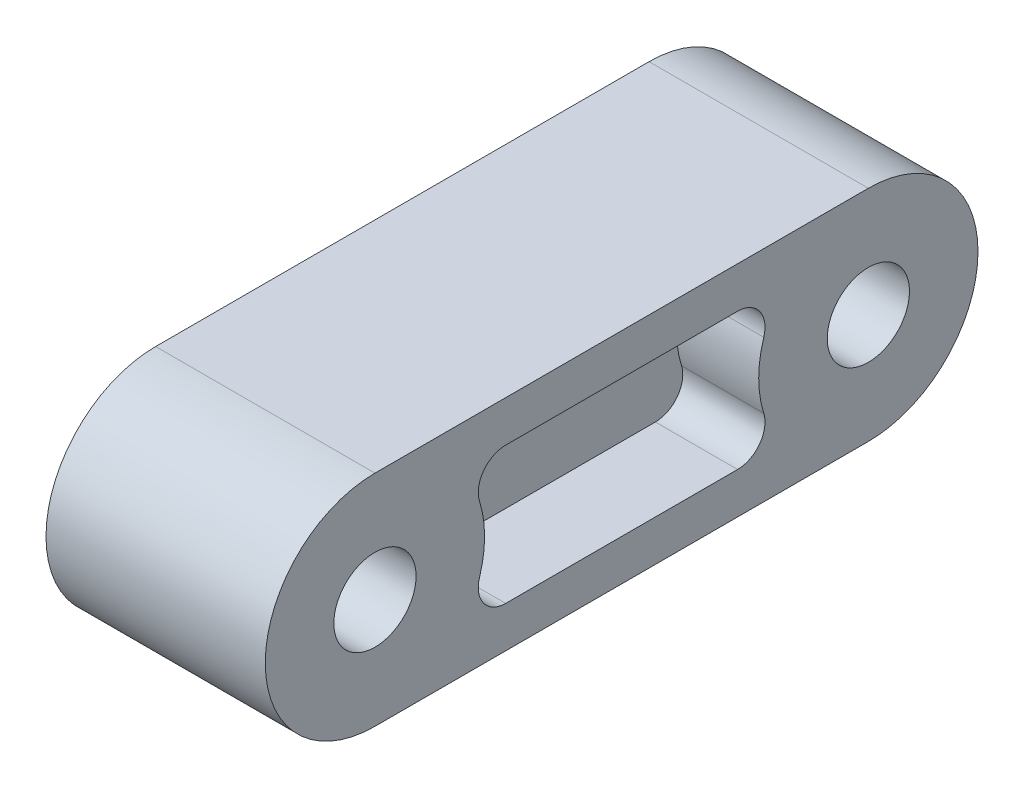
ISO-10303-21;
HEADER;
FILE_DESCRIPTION(('STEP AP214'),'2;1');
FILE_NAME('part.step','',(''),(''),'','','');
FILE_SCHEMA(('AUTOMOTIVE_DESIGN { 1 0 10303 214 1 1 1 1 }'));
ENDSEC;
DATA;
#1=APPLICATION_CONTEXT('core data for automotive mechanical design processes');
#2=APPLICATION_PROTOCOL_DEFINITION('international standard','automotive_design',2000,#1);
#3=PRODUCT_CONTEXT('',#1,'mechanical');
#4=PRODUCT('Part','Part','',(#3));
#5=PRODUCT_RELATED_PRODUCT_CATEGORY('part','',(#4));
#6=PRODUCT_DEFINITION_FORMATION('','',#4);
#7=PRODUCT_DEFINITION_CONTEXT('part definition',#1,'design');
#8=PRODUCT_DEFINITION('design','',#6,#7);
#9=PRODUCT_DEFINITION_SHAPE('','',#8);
#10=(LENGTH_UNIT() NAMED_UNIT(*) SI_UNIT(.MILLI.,.METRE.));
#11=(NAMED_UNIT(*) PLANE_ANGLE_UNIT() SI_UNIT($,.RADIAN.));
#12=(NAMED_UNIT(*) SI_UNIT($,.STERADIAN.) SOLID_ANGLE_UNIT());
#13=UNCERTAINTY_MEASURE_WITH_UNIT(LENGTH_MEASURE(1.E-05),#10,'distance_accuracy_value','');
#14=(GEOMETRIC_REPRESENTATION_CONTEXT(3) GLOBAL_UNCERTAINTY_ASSIGNED_CONTEXT((#13)) GLOBAL_UNIT_ASSIGNED_CONTEXT((#10,
#11,#12)) REPRESENTATION_CONTEXT('',''));
#15=CARTESIAN_POINT('',(0.,0.,0.));
#16=DIRECTION('',(0.,0.,1.));
#17=DIRECTION('',(1.,0.,0.));
#18=AXIS2_PLACEMENT_3D('',#15,#16,#17);
#19=CARTESIAN_POINT('',(-4.,0.,0.));
#20=DIRECTION('',(1.,0.,0.));
#21=DIRECTION('',(0.,0.,-1.));
#22=AXIS2_PLACEMENT_3D('',#19,#20,#21);
#23=PLANE('',#22);
#24=CARTESIAN_POINT('',(-4.,0.,-18.));
#25=DIRECTION('',(1.,0.,0.));
#26=DIRECTION('',(0.,0.,-1.));
#27=AXIS2_PLACEMENT_3D('',#24,#25,#26);
#28=CIRCLE('',#27,1.5);
#29=CARTESIAN_POINT('',(-4.,0.,-19.5));
#30=VERTEX_POINT('',#29);
#31=EDGE_CURVE('E314',#30,#30,#28,.T.);
#32=ORIENTED_EDGE('',*,*,#31,.T.);
#33=EDGE_LOOP('',(#32));
#34=FACE_BOUND('',#33,.T.);
#35=CARTESIAN_POINT('',(-4.,0.,0.));
#36=DIRECTION('',(1.,0.,0.));
#37=DIRECTION('',(0.,0.,-1.));
#38=AXIS2_PLACEMENT_3D('',#35,#36,#37);
#39=CIRCLE('',#38,1.5);
#40=CARTESIAN_POINT('',(-4.,0.,-1.5));
#41=VERTEX_POINT('',#40);
#42=EDGE_CURVE('E324',#41,#41,#39,.T.);
#43=ORIENTED_EDGE('',*,*,#42,.T.);
#44=EDGE_LOOP('',(#43));
#45=FACE_BOUND('',#44,.T.);
#46=CARTESIAN_POINT('',(-4.,0.,0.));
#47=DIRECTION('',(1.,0.,0.));
#48=DIRECTION('',(0.,0.,-1.));
#49=AXIS2_PLACEMENT_3D('',#46,#47,#48);
#50=CIRCLE('',#49,4.);
#51=CARTESIAN_POINT('',(-4.,4.,0.));
#52=VERTEX_POINT('',#51);
#53=CARTESIAN_POINT('',(-4.,-4.,0.));
#54=VERTEX_POINT('',#53);
#55=EDGE_CURVE('E203',#52,#54,#50,.T.);
#56=ORIENTED_EDGE('',*,*,#55,.F.);
#57=DIRECTION('',(0.,0.,1.));
#58=VECTOR('',#57,1.);
#59=CARTESIAN_POINT('',(-4.,4.,0.));
#60=LINE('',#59,#58);
#61=CARTESIAN_POINT('',(-4.,4.,-18.));
#62=VERTEX_POINT('',#61);
#63=EDGE_CURVE('E199',#62,#52,#60,.T.);
#64=ORIENTED_EDGE('',*,*,#63,.F.);
#65=CARTESIAN_POINT('',(-4.,0.,-18.));
#66=DIRECTION('',(1.,0.,0.));
#67=DIRECTION('',(0.,0.,-1.));
#68=AXIS2_PLACEMENT_3D('',#65,#66,#67);
#69=CIRCLE('',#68,4.);
#70=CARTESIAN_POINT('',(-4.,-4.,-18.));
#71=VERTEX_POINT('',#70);
#72=EDGE_CURVE('E338',#71,#62,#69,.T.);
#73=ORIENTED_EDGE('',*,*,#72,.F.);
#74=DIRECTION('',(0.,0.,-1.));
#75=VECTOR('',#74,1.);
#76=CARTESIAN_POINT('',(-4.,-4.,0.));
#77=LINE('',#76,#75);
#78=EDGE_CURVE('E336',#54,#71,#77,.T.);
#79=ORIENTED_EDGE('',*,*,#78,.F.);
#80=EDGE_LOOP('',(#56,#64,#73,#79));
#81=FACE_BOUND('',#80,.T.);
#82=DIRECTION('',(0.,0.,-1.));
#83=VECTOR('',#82,1.);
#84=CARTESIAN_POINT('',(-4.,-2.5,-3.1224989991992));
#85=LINE('',#84,#83);
#86=CARTESIAN_POINT('',(-4.,-2.5,-4.76969600708473));
#87=VERTEX_POINT('',#86);
#88=CARTESIAN_POINT('',(-4.,-2.5,-13.2303039929153));
#89=VERTEX_POINT('',#88);
#90=EDGE_CURVE('E437',#87,#89,#85,.T.);
#91=ORIENTED_EDGE('',*,*,#90,.T.);
#92=CARTESIAN_POINT('',(-4.,-1.5,-13.2303039929153));
#93=DIRECTION('',(1.,0.,0.));
#94=DIRECTION('',(0.,0.,-1.));
#95=AXIS2_PLACEMENT_3D('',#92,#93,#94);
#96=CIRCLE('',#95,1.);
#97=CARTESIAN_POINT('',(-4.,-1.2,-14.1842431943322));
#98=VERTEX_POINT('',#97);
#99=EDGE_CURVE('E270',#89,#98,#96,.T.);
#100=ORIENTED_EDGE('',*,*,#99,.T.);
#101=CARTESIAN_POINT('',(-4.,0.,-18.));
#102=DIRECTION('',(-1.,0.,0.));
#103=DIRECTION('',(0.,0.,-1.));
#104=AXIS2_PLACEMENT_3D('',#101,#102,#103);
#105=CIRCLE('',#104,4.);
#106=CARTESIAN_POINT('',(-4.,1.2,-14.1842431943322));
#107=VERTEX_POINT('',#106);
#108=EDGE_CURVE('E438',#98,#107,#105,.T.);
#109=ORIENTED_EDGE('',*,*,#108,.T.);
#110=CARTESIAN_POINT('',(-4.,1.5,-13.2303039929153));
#111=DIRECTION('',(1.,0.,0.));
#112=DIRECTION('',(0.,0.,-1.));
#113=AXIS2_PLACEMENT_3D('',#110,#111,#112);
#114=CIRCLE('',#113,1.);
#115=CARTESIAN_POINT('',(-4.,2.5,-13.2303039929153));
#116=VERTEX_POINT('',#115);
#117=EDGE_CURVE('E268',#107,#116,#114,.T.);
#118=ORIENTED_EDGE('',*,*,#117,.T.);
#119=DIRECTION('',(0.,0.,1.));
#120=VECTOR('',#119,1.);
#121=CARTESIAN_POINT('',(-4.,2.5,-14.8775010008008));
#122=LINE('',#121,#120);
#123=CARTESIAN_POINT('',(-4.,2.5,-4.76969600708473));
#124=VERTEX_POINT('',#123);
#125=EDGE_CURVE('E308',#116,#124,#122,.T.);
#126=ORIENTED_EDGE('',*,*,#125,.T.);
#127=CARTESIAN_POINT('',(-4.,1.5,-4.76969600708473));
#128=DIRECTION('',(1.,0.,0.));
#129=DIRECTION('',(0.,0.,-1.));
#130=AXIS2_PLACEMENT_3D('',#127,#128,#129);
#131=CIRCLE('',#130,1.);
#132=CARTESIAN_POINT('',(-4.,1.2,-3.81575680566778));
#133=VERTEX_POINT('',#132);
#134=EDGE_CURVE('E266',#124,#133,#131,.T.);
#135=ORIENTED_EDGE('',*,*,#134,.T.);
#136=CARTESIAN_POINT('',(-4.,0.,0.));
#137=DIRECTION('',(-1.,0.,0.));
#138=DIRECTION('',(0.,0.,-1.));
#139=AXIS2_PLACEMENT_3D('',#136,#137,#138);
#140=CIRCLE('',#139,4.);
#141=CARTESIAN_POINT('',(-4.,-1.2,-3.81575680566778));
#142=VERTEX_POINT('',#141);
#143=EDGE_CURVE('E432',#133,#142,#140,.T.);
#144=ORIENTED_EDGE('',*,*,#143,.T.);
#145=CARTESIAN_POINT('',(-4.,-1.5,-4.76969600708473));
#146=DIRECTION('',(1.,0.,0.));
#147=DIRECTION('',(0.,0.,-1.));
#148=AXIS2_PLACEMENT_3D('',#145,#146,#147);
#149=CIRCLE('',#148,1.);
#150=EDGE_CURVE('E264',#142,#87,#149,.T.);
#151=ORIENTED_EDGE('',*,*,#150,.T.);
#152=EDGE_LOOP('',(#91,#100,#109,#118,#126,#135,#144,#151));
#153=FACE_BOUND('',#152,.T.);
#154=ADVANCED_FACE('F41',(#34,#45,#81,#153),#23,.F.);
#155=CARTESIAN_POINT('',(4.,0.,0.));
#156=DIRECTION('',(1.,0.,0.));
#157=DIRECTION('',(0.,0.,-1.));
#158=AXIS2_PLACEMENT_3D('',#155,#156,#157);
#159=PLANE('',#158);
#160=CARTESIAN_POINT('',(4.,0.,-18.));
#161=DIRECTION('',(-1.,0.,0.));
#162=DIRECTION('',(0.,0.,-1.));
#163=AXIS2_PLACEMENT_3D('',#160,#161,#162);
#164=CIRCLE('',#163,4.);
#165=CARTESIAN_POINT('',(4.,-1.2,-14.1842431943322));
#166=VERTEX_POINT('',#165);
#167=CARTESIAN_POINT('',(4.,1.2,-14.1842431943322));
#168=VERTEX_POINT('',#167);
#169=EDGE_CURVE('E279',#166,#168,#164,.T.);
#170=ORIENTED_EDGE('',*,*,#169,.F.);
#171=CARTESIAN_POINT('',(4.,-1.5,-13.2303039929153));
#172=DIRECTION('',(1.,0.,0.));
#173=DIRECTION('',(0.,0.,-1.));
#174=AXIS2_PLACEMENT_3D('',#171,#172,#173);
#175=CIRCLE('',#174,1.);
#176=CARTESIAN_POINT('',(4.,-2.5,-13.2303039929153));
#177=VERTEX_POINT('',#176);
#178=EDGE_CURVE('E49',#166,#177,#175,.F.);
#179=ORIENTED_EDGE('',*,*,#178,.T.);
#180=DIRECTION('',(0.,0.,-1.));
#181=VECTOR('',#180,1.);
#182=CARTESIAN_POINT('',(4.,-2.5,-3.1224989991992));
#183=LINE('',#182,#181);
#184=CARTESIAN_POINT('',(4.,-2.5,-4.76969600708473));
#185=VERTEX_POINT('',#184);
#186=EDGE_CURVE('E277',#185,#177,#183,.T.);
#187=ORIENTED_EDGE('',*,*,#186,.F.);
#188=CARTESIAN_POINT('',(4.,-1.5,-4.76969600708473));
#189=DIRECTION('',(1.,0.,0.));
#190=DIRECTION('',(0.,0.,-1.));
#191=AXIS2_PLACEMENT_3D('',#188,#189,#190);
#192=CIRCLE('',#191,1.);
#193=CARTESIAN_POINT('',(4.,-1.2,-3.81575680566778));
#194=VERTEX_POINT('',#193);
#195=EDGE_CURVE('E56',#185,#194,#192,.F.);
#196=ORIENTED_EDGE('',*,*,#195,.T.);
#197=CARTESIAN_POINT('',(4.,0.,0.));
#198=DIRECTION('',(-1.,0.,0.));
#199=DIRECTION('',(0.,0.,-1.));
#200=AXIS2_PLACEMENT_3D('',#197,#198,#199);
#201=CIRCLE('',#200,4.);
#202=CARTESIAN_POINT('',(4.,1.2,-3.81575680566778));
#203=VERTEX_POINT('',#202);
#204=EDGE_CURVE('E289',#203,#194,#201,.T.);
#205=ORIENTED_EDGE('',*,*,#204,.F.);
#206=CARTESIAN_POINT('',(4.,1.5,-4.76969600708473));
#207=DIRECTION('',(1.,0.,0.));
#208=DIRECTION('',(0.,0.,-1.));
#209=AXIS2_PLACEMENT_3D('',#206,#207,#208);
#210=CIRCLE('',#209,1.);
#211=CARTESIAN_POINT('',(4.,2.5,-4.76969600708473));
#212=VERTEX_POINT('',#211);
#213=EDGE_CURVE('E11',#203,#212,#210,.F.);
#214=ORIENTED_EDGE('',*,*,#213,.T.);
#215=DIRECTION('',(0.,0.,1.));
#216=VECTOR('',#215,1.);
#217=CARTESIAN_POINT('',(4.,2.5,-14.8775010008008));
#218=LINE('',#217,#216);
#219=CARTESIAN_POINT('',(4.,2.5,-13.2303039929153));
#220=VERTEX_POINT('',#219);
#221=EDGE_CURVE('E316',#220,#212,#218,.T.);
#222=ORIENTED_EDGE('',*,*,#221,.F.);
#223=CARTESIAN_POINT('',(4.,1.5,-13.2303039929153));
#224=DIRECTION('',(1.,0.,0.));
#225=DIRECTION('',(0.,0.,-1.));
#226=AXIS2_PLACEMENT_3D('',#223,#224,#225);
#227=CIRCLE('',#226,1.);
#228=EDGE_CURVE('E272',#220,#168,#227,.F.);
#229=ORIENTED_EDGE('',*,*,#228,.T.);
#230=EDGE_LOOP('',(#170,#179,#187,#196,#205,#214,#222,#229));
#231=FACE_BOUND('',#230,.T.);
#232=CARTESIAN_POINT('',(4.,0.,0.));
#233=DIRECTION('',(1.,0.,0.));
#234=DIRECTION('',(0.,0.,-1.));
#235=AXIS2_PLACEMENT_3D('',#232,#233,#234);
#236=CIRCLE('',#235,1.5);
#237=CARTESIAN_POINT('',(4.,0.,-1.5));
#238=VERTEX_POINT('',#237);
#239=EDGE_CURVE('E327',#238,#238,#236,.T.);
#240=ORIENTED_EDGE('',*,*,#239,.F.);
#241=EDGE_LOOP('',(#240));
#242=FACE_BOUND('',#241,.T.);
#243=CARTESIAN_POINT('',(4.,0.,0.));
#244=DIRECTION('',(1.,0.,0.));
#245=DIRECTION('',(0.,0.,-1.));
#246=AXIS2_PLACEMENT_3D('',#243,#244,#245);
#247=CIRCLE('',#246,4.);
#248=CARTESIAN_POINT('',(4.,4.,0.));
#249=VERTEX_POINT('',#248);
#250=CARTESIAN_POINT('',(4.,-4.,0.));
#251=VERTEX_POINT('',#250);
#252=EDGE_CURVE('E189',#249,#251,#247,.T.);
#253=ORIENTED_EDGE('',*,*,#252,.T.);
#254=DIRECTION('',(0.,0.,-1.));
#255=VECTOR('',#254,1.);
#256=CARTESIAN_POINT('',(4.,-4.,0.));
#257=LINE('',#256,#255);
#258=CARTESIAN_POINT('',(4.,-4.,-18.));
#259=VERTEX_POINT('',#258);
#260=EDGE_CURVE('E178',#251,#259,#257,.T.);
#261=ORIENTED_EDGE('',*,*,#260,.T.);
#262=CARTESIAN_POINT('',(4.,0.,-18.));
#263=DIRECTION('',(1.,0.,0.));
#264=DIRECTION('',(0.,0.,-1.));
#265=AXIS2_PLACEMENT_3D('',#262,#263,#264);
#266=CIRCLE('',#265,4.);
#267=CARTESIAN_POINT('',(4.,4.,-18.));
#268=VERTEX_POINT('',#267);
#269=EDGE_CURVE('E188',#259,#268,#266,.T.);
#270=ORIENTED_EDGE('',*,*,#269,.T.);
#271=DIRECTION('',(0.,0.,1.));
#272=VECTOR('',#271,1.);
#273=CARTESIAN_POINT('',(4.,4.,0.));
#274=LINE('',#273,#272);
#275=EDGE_CURVE('E195',#268,#249,#274,.T.);
#276=ORIENTED_EDGE('',*,*,#275,.T.);
#277=EDGE_LOOP('',(#253,#261,#270,#276));
#278=FACE_BOUND('',#277,.T.);
#279=CARTESIAN_POINT('',(4.,0.,-18.));
#280=DIRECTION('',(1.,0.,0.));
#281=DIRECTION('',(0.,0.,-1.));
#282=AXIS2_PLACEMENT_3D('',#279,#280,#281);
#283=CIRCLE('',#282,1.5);
#284=CARTESIAN_POINT('',(4.,0.,-19.5));
#285=VERTEX_POINT('',#284);
#286=EDGE_CURVE('E321',#285,#285,#283,.T.);
#287=ORIENTED_EDGE('',*,*,#286,.F.);
#288=EDGE_LOOP('',(#287));
#289=FACE_BOUND('',#288,.T.);
#290=ADVANCED_FACE('F192',(#231,#242,#278,#289),#159,.T.);
#291=CARTESIAN_POINT('',(4.,0.,0.));
#292=DIRECTION('',(-1.,0.,0.));
#293=DIRECTION('',(0.,0.,1.));
#294=AXIS2_PLACEMENT_3D('',#291,#292,#293);
#295=CYLINDRICAL_SURFACE('',#294,4.);
#296=ORIENTED_EDGE('',*,*,#55,.T.);
#297=DIRECTION('',(-1.,0.,0.));
#298=VECTOR('',#297,1.);
#299=CARTESIAN_POINT('',(4.,-4.,0.));
#300=LINE('',#299,#298);
#301=EDGE_CURVE('E182',#251,#54,#300,.T.);
#302=ORIENTED_EDGE('',*,*,#301,.F.);
#303=ORIENTED_EDGE('',*,*,#252,.F.);
#304=DIRECTION('',(-1.,0.,0.));
#305=VECTOR('',#304,1.);
#306=CARTESIAN_POINT('',(4.,4.,0.));
#307=LINE('',#306,#305);
#308=EDGE_CURVE('E334',#249,#52,#307,.T.);
#309=ORIENTED_EDGE('',*,*,#308,.T.);
#310=EDGE_LOOP('',(#296,#302,#303,#309));
#311=FACE_BOUND('',#310,.T.);
#312=ADVANCED_FACE('F201',(#311),#295,.T.);
#313=CARTESIAN_POINT('',(4.,-4.,0.));
#314=DIRECTION('',(0.,1.,0.));
#315=DIRECTION('',(0.,0.,1.));
#316=AXIS2_PLACEMENT_3D('',#313,#314,#315);
#317=PLANE('',#316);
#318=ORIENTED_EDGE('',*,*,#78,.T.);
#319=DIRECTION('',(-1.,0.,0.));
#320=VECTOR('',#319,1.);
#321=CARTESIAN_POINT('',(4.,-4.,-18.));
#322=LINE('',#321,#320);
#323=EDGE_CURVE('E185',#259,#71,#322,.T.);
#324=ORIENTED_EDGE('',*,*,#323,.F.);
#325=ORIENTED_EDGE('',*,*,#260,.F.);
#326=ORIENTED_EDGE('',*,*,#301,.T.);
#327=EDGE_LOOP('',(#318,#324,#325,#326));
#328=FACE_BOUND('',#327,.T.);
#329=ADVANCED_FACE('F180',(#328),#317,.F.);
#330=CARTESIAN_POINT('',(4.,0.,-18.));
#331=DIRECTION('',(-1.,0.,0.));
#332=DIRECTION('',(0.,0.,1.));
#333=AXIS2_PLACEMENT_3D('',#330,#331,#332);
#334=CYLINDRICAL_SURFACE('',#333,4.);
#335=ORIENTED_EDGE('',*,*,#72,.T.);
#336=DIRECTION('',(-1.,0.,0.));
#337=VECTOR('',#336,1.);
#338=CARTESIAN_POINT('',(4.,4.,-18.));
#339=LINE('',#338,#337);
#340=EDGE_CURVE('E208',#268,#62,#339,.T.);
#341=ORIENTED_EDGE('',*,*,#340,.F.);
#342=ORIENTED_EDGE('',*,*,#269,.F.);
#343=ORIENTED_EDGE('',*,*,#323,.T.);
#344=EDGE_LOOP('',(#335,#341,#342,#343));
#345=FACE_BOUND('',#344,.T.);
#346=ADVANCED_FACE('F350',(#345),#334,.T.);
#347=CARTESIAN_POINT('',(4.,4.,0.));
#348=DIRECTION('',(0.,-1.,0.));
#349=DIRECTION('',(0.,0.,-1.));
#350=AXIS2_PLACEMENT_3D('',#347,#348,#349);
#351=PLANE('',#350);
#352=ORIENTED_EDGE('',*,*,#63,.T.);
#353=ORIENTED_EDGE('',*,*,#308,.F.);
#354=ORIENTED_EDGE('',*,*,#275,.F.);
#355=ORIENTED_EDGE('',*,*,#340,.T.);
#356=EDGE_LOOP('',(#352,#353,#354,#355));
#357=FACE_BOUND('',#356,.T.);
#358=ADVANCED_FACE('F345',(#357),#351,.F.);
#359=CARTESIAN_POINT('',(4.,0.,0.));
#360=DIRECTION('',(-1.,0.,0.));
#361=DIRECTION('',(0.,0.,1.));
#362=AXIS2_PLACEMENT_3D('',#359,#360,#361);
#363=CYLINDRICAL_SURFACE('',#362,1.5);
#364=ORIENTED_EDGE('',*,*,#239,.T.);
#365=EDGE_LOOP('',(#364));
#366=FACE_BOUND('',#365,.T.);
#367=ORIENTED_EDGE('',*,*,#42,.F.);
#368=EDGE_LOOP('',(#367));
#369=FACE_BOUND('',#368,.T.);
#370=ADVANCED_FACE('F357',(#366,#369),#363,.F.);
#371=CARTESIAN_POINT('',(4.,0.,-18.));
#372=DIRECTION('',(-1.,0.,0.));
#373=DIRECTION('',(0.,0.,1.));
#374=AXIS2_PLACEMENT_3D('',#371,#372,#373);
#375=CYLINDRICAL_SURFACE('',#374,1.5);
#376=ORIENTED_EDGE('',*,*,#286,.T.);
#377=EDGE_LOOP('',(#376));
#378=FACE_BOUND('',#377,.T.);
#379=ORIENTED_EDGE('',*,*,#31,.F.);
#380=EDGE_LOOP('',(#379));
#381=FACE_BOUND('',#380,.T.);
#382=ADVANCED_FACE('F372',(#378,#381),#375,.F.);
#383=CARTESIAN_POINT('',(1.,0.,-18.));
#384=DIRECTION('',(1.,0.,0.));
#385=DIRECTION('',(0.,0.,-1.));
#386=AXIS2_PLACEMENT_3D('',#383,#384,#385);
#387=CYLINDRICAL_SURFACE('',#386,4.);
#388=ORIENTED_EDGE('',*,*,#169,.T.);
#389=DIRECTION('',(1.,0.,0.));
#390=VECTOR('',#389,1.);
#391=CARTESIAN_POINT('',(1.,1.2,-14.1842431943322));
#392=LINE('',#391,#390);
#393=CARTESIAN_POINT('',(1.,1.2,-14.1842431943322));
#394=VERTEX_POINT('',#393);
#395=EDGE_CURVE('E245',#168,#394,#392,.F.);
#396=ORIENTED_EDGE('',*,*,#395,.T.);
#397=CARTESIAN_POINT('',(1.,0.,-18.));
#398=DIRECTION('',(-1.,0.,0.));
#399=DIRECTION('',(0.,0.,-1.));
#400=AXIS2_PLACEMENT_3D('',#397,#398,#399);
#401=CIRCLE('',#400,4.);
#402=CARTESIAN_POINT('',(1.,-1.2,-14.1842431943322));
#403=VERTEX_POINT('',#402);
#404=EDGE_CURVE('E288',#403,#394,#401,.T.);
#405=ORIENTED_EDGE('',*,*,#404,.F.);
#406=DIRECTION('',(1.,0.,0.));
#407=VECTOR('',#406,1.);
#408=CARTESIAN_POINT('',(1.,-1.2,-14.1842431943322));
#409=LINE('',#408,#407);
#410=EDGE_CURVE('E242',#403,#166,#409,.T.);
#411=ORIENTED_EDGE('',*,*,#410,.T.);
#412=EDGE_LOOP('',(#388,#396,#405,#411));
#413=FACE_BOUND('',#412,.T.);
#414=ADVANCED_FACE('F300',(#413),#387,.T.);
#415=CARTESIAN_POINT('',(1.,-2.5,-3.1224989991992));
#416=DIRECTION('',(0.,-1.,0.));
#417=DIRECTION('',(0.,0.,-1.));
#418=AXIS2_PLACEMENT_3D('',#415,#416,#417);
#419=PLANE('',#418);
#420=DIRECTION('',(0.,0.,-1.));
#421=VECTOR('',#420,1.);
#422=CARTESIAN_POINT('',(1.,-2.5,-3.1224989991992));
#423=LINE('',#422,#421);
#424=CARTESIAN_POINT('',(1.,-2.5,-4.76969600708473));
#425=VERTEX_POINT('',#424);
#426=CARTESIAN_POINT('',(1.,-2.5,-13.2303039929153));
#427=VERTEX_POINT('',#426);
#428=EDGE_CURVE('E298',#425,#427,#423,.T.);
#429=ORIENTED_EDGE('',*,*,#428,.F.);
#430=DIRECTION('',(-1.,0.,0.));
#431=VECTOR('',#430,1.);
#432=CARTESIAN_POINT('',(4.,-2.5,-4.76969600708473));
#433=LINE('',#432,#431);
#434=EDGE_CURVE('E257',#425,#185,#433,.F.);
#435=ORIENTED_EDGE('',*,*,#434,.T.);
#436=ORIENTED_EDGE('',*,*,#186,.T.);
#437=DIRECTION('',(-1.,0.,0.));
#438=VECTOR('',#437,1.);
#439=CARTESIAN_POINT('',(1.,-2.5,-13.2303039929153));
#440=LINE('',#439,#438);
#441=EDGE_CURVE('E255',#177,#427,#440,.T.);
#442=ORIENTED_EDGE('',*,*,#441,.T.);
#443=EDGE_LOOP('',(#429,#435,#436,#442));
#444=FACE_BOUND('',#443,.T.);
#445=ADVANCED_FACE('F285',(#444),#419,.F.);
#446=CARTESIAN_POINT('',(1.,0.,0.));
#447=DIRECTION('',(1.,0.,0.));
#448=DIRECTION('',(0.,0.,-1.));
#449=AXIS2_PLACEMENT_3D('',#446,#447,#448);
#450=CYLINDRICAL_SURFACE('',#449,4.);
#451=ORIENTED_EDGE('',*,*,#204,.T.);
#452=DIRECTION('',(1.,0.,0.));
#453=VECTOR('',#452,1.);
#454=CARTESIAN_POINT('',(1.,-1.2,-3.81575680566778));
#455=LINE('',#454,#453);
#456=CARTESIAN_POINT('',(1.,-1.2,-3.81575680566778));
#457=VERTEX_POINT('',#456);
#458=EDGE_CURVE('E262',#194,#457,#455,.F.);
#459=ORIENTED_EDGE('',*,*,#458,.T.);
#460=CARTESIAN_POINT('',(1.,0.,0.));
#461=DIRECTION('',(-1.,0.,0.));
#462=DIRECTION('',(0.,0.,-1.));
#463=AXIS2_PLACEMENT_3D('',#460,#461,#462);
#464=CIRCLE('',#463,4.);
#465=CARTESIAN_POINT('',(1.,1.2,-3.81575680566778));
#466=VERTEX_POINT('',#465);
#467=EDGE_CURVE('E305',#466,#457,#464,.T.);
#468=ORIENTED_EDGE('',*,*,#467,.F.);
#469=DIRECTION('',(1.,0.,0.));
#470=VECTOR('',#469,1.);
#471=CARTESIAN_POINT('',(1.,1.2,-3.81575680566778));
#472=LINE('',#471,#470);
#473=EDGE_CURVE('E260',#466,#203,#472,.T.);
#474=ORIENTED_EDGE('',*,*,#473,.T.);
#475=EDGE_LOOP('',(#451,#459,#468,#474));
#476=FACE_BOUND('',#475,.T.);
#477=ADVANCED_FACE('F381',(#476),#450,.T.);
#478=CARTESIAN_POINT('',(1.,2.5,-14.8775010008008));
#479=DIRECTION('',(0.,1.,0.));
#480=DIRECTION('',(0.,0.,1.));
#481=AXIS2_PLACEMENT_3D('',#478,#479,#480);
#482=PLANE('',#481);
#483=DIRECTION('',(0.,0.,1.));
#484=VECTOR('',#483,1.);
#485=CARTESIAN_POINT('',(1.,2.5,-14.8775010008008));
#486=LINE('',#485,#484);
#487=CARTESIAN_POINT('',(1.,2.5,-13.2303039929153));
#488=VERTEX_POINT('',#487);
#489=CARTESIAN_POINT('',(1.,2.5,-4.76969600708473));
#490=VERTEX_POINT('',#489);
#491=EDGE_CURVE('E302',#488,#490,#486,.T.);
#492=ORIENTED_EDGE('',*,*,#491,.F.);
#493=DIRECTION('',(-1.,0.,0.));
#494=VECTOR('',#493,1.);
#495=CARTESIAN_POINT('',(4.,2.5,-13.2303039929153));
#496=LINE('',#495,#494);
#497=EDGE_CURVE('E239',#488,#220,#496,.F.);
#498=ORIENTED_EDGE('',*,*,#497,.T.);
#499=ORIENTED_EDGE('',*,*,#221,.T.);
#500=DIRECTION('',(-1.,0.,0.));
#501=VECTOR('',#500,1.);
#502=CARTESIAN_POINT('',(1.,2.5,-4.76969600708473));
#503=LINE('',#502,#501);
#504=EDGE_CURVE('E237',#212,#490,#503,.T.);
#505=ORIENTED_EDGE('',*,*,#504,.T.);
#506=EDGE_LOOP('',(#492,#498,#499,#505));
#507=FACE_BOUND('',#506,.T.);
#508=ADVANCED_FACE('F378',(#507),#482,.F.);
#509=CARTESIAN_POINT('',(1.,0.,-18.));
#510=DIRECTION('',(1.,0.,0.));
#511=DIRECTION('',(0.,0.,-1.));
#512=AXIS2_PLACEMENT_3D('',#509,#510,#511);
#513=PLANE('',#512);
#514=ORIENTED_EDGE('',*,*,#404,.T.);
#515=CARTESIAN_POINT('',(1.,1.5,-13.2303039929153));
#516=DIRECTION('',(1.,0.,0.));
#517=DIRECTION('',(0.,0.,-1.));
#518=AXIS2_PLACEMENT_3D('',#515,#516,#517);
#519=CIRCLE('',#518,1.);
#520=EDGE_CURVE('E253',#394,#488,#519,.T.);
#521=ORIENTED_EDGE('',*,*,#520,.T.);
#522=ORIENTED_EDGE('',*,*,#491,.T.);
#523=CARTESIAN_POINT('',(1.,1.5,-4.76969600708473));
#524=DIRECTION('',(1.,0.,0.));
#525=DIRECTION('',(0.,0.,-1.));
#526=AXIS2_PLACEMENT_3D('',#523,#524,#525);
#527=CIRCLE('',#526,1.);
#528=EDGE_CURVE('E247',#490,#466,#527,.T.);
#529=ORIENTED_EDGE('',*,*,#528,.T.);
#530=ORIENTED_EDGE('',*,*,#467,.T.);
#531=CARTESIAN_POINT('',(1.,-1.5,-4.76969600708473));
#532=DIRECTION('',(1.,0.,0.));
#533=DIRECTION('',(0.,0.,-1.));
#534=AXIS2_PLACEMENT_3D('',#531,#532,#533);
#535=CIRCLE('',#534,1.);
#536=EDGE_CURVE('E251',#457,#425,#535,.T.);
#537=ORIENTED_EDGE('',*,*,#536,.T.);
#538=ORIENTED_EDGE('',*,*,#428,.T.);
#539=CARTESIAN_POINT('',(1.,-1.5,-13.2303039929153));
#540=DIRECTION('',(1.,0.,0.));
#541=DIRECTION('',(0.,0.,-1.));
#542=AXIS2_PLACEMENT_3D('',#539,#540,#541);
#543=CIRCLE('',#542,1.);
#544=EDGE_CURVE('E249',#427,#403,#543,.T.);
#545=ORIENTED_EDGE('',*,*,#544,.T.);
#546=EDGE_LOOP('',(#514,#521,#522,#529,#530,#537,#538,#545));
#547=FACE_BOUND('',#546,.T.);
#548=ADVANCED_FACE('F296',(#547),#513,.T.);
#549=CARTESIAN_POINT('',(-1.,0.,-18.));
#550=DIRECTION('',(-1.,0.,0.));
#551=DIRECTION('',(0.,0.,1.));
#552=AXIS2_PLACEMENT_3D('',#549,#550,#551);
#553=CYLINDRICAL_SURFACE('',#552,4.);
#554=CARTESIAN_POINT('',(-1.,0.,-18.));
#555=DIRECTION('',(-1.,0.,0.));
#556=DIRECTION('',(0.,0.,-1.));
#557=AXIS2_PLACEMENT_3D('',#554,#555,#556);
#558=CIRCLE('',#557,4.);
#559=CARTESIAN_POINT('',(-1.,-1.2,-14.1842431943322));
#560=VERTEX_POINT('',#559);
#561=CARTESIAN_POINT('',(-1.,1.2,-14.1842431943322));
#562=VERTEX_POINT('',#561);
#563=EDGE_CURVE('E426',#560,#562,#558,.T.);
#564=ORIENTED_EDGE('',*,*,#563,.T.);
#565=DIRECTION('',(-1.,0.,0.));
#566=VECTOR('',#565,1.);
#567=CARTESIAN_POINT('',(-1.,1.2,-14.1842431943322));
#568=LINE('',#567,#566);
#569=EDGE_CURVE('E234',#562,#107,#568,.T.);
#570=ORIENTED_EDGE('',*,*,#569,.T.);
#571=ORIENTED_EDGE('',*,*,#108,.F.);
#572=DIRECTION('',(-1.,0.,0.));
#573=VECTOR('',#572,1.);
#574=CARTESIAN_POINT('',(-1.,-1.2,-14.1842431943322));
#575=LINE('',#574,#573);
#576=EDGE_CURVE('E232',#98,#560,#575,.F.);
#577=ORIENTED_EDGE('',*,*,#576,.T.);
#578=EDGE_LOOP('',(#564,#570,#571,#577));
#579=FACE_BOUND('',#578,.T.);
#580=ADVANCED_FACE('F390',(#579),#553,.T.);
#581=CARTESIAN_POINT('',(-1.,2.5,-14.8775010008008));
#582=DIRECTION('',(0.,-1.,0.));
#583=DIRECTION('',(0.,0.,-1.));
#584=AXIS2_PLACEMENT_3D('',#581,#582,#583);
#585=PLANE('',#584);
#586=DIRECTION('',(0.,0.,1.));
#587=VECTOR('',#586,1.);
#588=CARTESIAN_POINT('',(-1.,2.5,-14.8775010008008));
#589=LINE('',#588,#587);
#590=CARTESIAN_POINT('',(-1.,2.5,-13.2303039929153));
#591=VERTEX_POINT('',#590);
#592=CARTESIAN_POINT('',(-1.,2.5,-4.76969600708473));
#593=VERTEX_POINT('',#592);
#594=EDGE_CURVE('E317',#591,#593,#589,.T.);
#595=ORIENTED_EDGE('',*,*,#594,.T.);
#596=DIRECTION('',(1.,0.,0.));
#597=VECTOR('',#596,1.);
#598=CARTESIAN_POINT('',(-4.,2.5,-4.76969600708473));
#599=LINE('',#598,#597);
#600=EDGE_CURVE('E229',#593,#124,#599,.F.);
#601=ORIENTED_EDGE('',*,*,#600,.T.);
#602=ORIENTED_EDGE('',*,*,#125,.F.);
#603=DIRECTION('',(1.,0.,0.));
#604=VECTOR('',#603,1.);
#605=CARTESIAN_POINT('',(-1.,2.5,-13.2303039929153));
#606=LINE('',#605,#604);
#607=EDGE_CURVE('E227',#116,#591,#606,.T.);
#608=ORIENTED_EDGE('',*,*,#607,.T.);
#609=EDGE_LOOP('',(#595,#601,#602,#608));
#610=FACE_BOUND('',#609,.T.);
#611=ADVANCED_FACE('F393',(#610),#585,.T.);
#612=CARTESIAN_POINT('',(-1.,0.,0.));
#613=DIRECTION('',(-1.,0.,0.));
#614=DIRECTION('',(0.,0.,1.));
#615=AXIS2_PLACEMENT_3D('',#612,#613,#614);
#616=CYLINDRICAL_SURFACE('',#615,4.);
#617=CARTESIAN_POINT('',(-1.,0.,0.));
#618=DIRECTION('',(-1.,0.,0.));
#619=DIRECTION('',(0.,0.,-1.));
#620=AXIS2_PLACEMENT_3D('',#617,#618,#619);
#621=CIRCLE('',#620,4.);
#622=CARTESIAN_POINT('',(-1.,1.2,-3.81575680566778));
#623=VERTEX_POINT('',#622);
#624=CARTESIAN_POINT('',(-1.,-1.2,-3.81575680566778));
#625=VERTEX_POINT('',#624);
#626=EDGE_CURVE('E425',#623,#625,#621,.T.);
#627=ORIENTED_EDGE('',*,*,#626,.T.);
#628=DIRECTION('',(-1.,0.,0.));
#629=VECTOR('',#628,1.);
#630=CARTESIAN_POINT('',(-1.,-1.2,-3.81575680566778));
#631=LINE('',#630,#629);
#632=EDGE_CURVE('E206',#625,#142,#631,.T.);
#633=ORIENTED_EDGE('',*,*,#632,.T.);
#634=ORIENTED_EDGE('',*,*,#143,.F.);
#635=DIRECTION('',(-1.,0.,0.));
#636=VECTOR('',#635,1.);
#637=CARTESIAN_POINT('',(-1.,1.2,-3.81575680566778));
#638=LINE('',#637,#636);
#639=EDGE_CURVE('E204',#133,#623,#638,.F.);
#640=ORIENTED_EDGE('',*,*,#639,.T.);
#641=EDGE_LOOP('',(#627,#633,#634,#640));
#642=FACE_BOUND('',#641,.T.);
#643=ADVANCED_FACE('F399',(#642),#616,.T.);
#644=CARTESIAN_POINT('',(-1.,-2.5,-3.1224989991992));
#645=DIRECTION('',(0.,1.,0.));
#646=DIRECTION('',(0.,0.,1.));
#647=AXIS2_PLACEMENT_3D('',#644,#645,#646);
#648=PLANE('',#647);
#649=ORIENTED_EDGE('',*,*,#90,.F.);
#650=DIRECTION('',(1.,0.,0.));
#651=VECTOR('',#650,1.);
#652=CARTESIAN_POINT('',(-1.,-2.5,-4.76969600708473));
#653=LINE('',#652,#651);
#654=CARTESIAN_POINT('',(-1.,-2.5,-4.76969600708473));
#655=VERTEX_POINT('',#654);
#656=EDGE_CURVE('E217',#87,#655,#653,.T.);
#657=ORIENTED_EDGE('',*,*,#656,.T.);
#658=DIRECTION('',(0.,0.,-1.));
#659=VECTOR('',#658,1.);
#660=CARTESIAN_POINT('',(-1.,-2.5,-3.1224989991992));
#661=LINE('',#660,#659);
#662=CARTESIAN_POINT('',(-1.,-2.5,-13.2303039929153));
#663=VERTEX_POINT('',#662);
#664=EDGE_CURVE('E418',#655,#663,#661,.T.);
#665=ORIENTED_EDGE('',*,*,#664,.T.);
#666=DIRECTION('',(1.,0.,0.));
#667=VECTOR('',#666,1.);
#668=CARTESIAN_POINT('',(-4.,-2.5,-13.2303039929153));
#669=LINE('',#668,#667);
#670=EDGE_CURVE('E214',#663,#89,#669,.F.);
#671=ORIENTED_EDGE('',*,*,#670,.T.);
#672=EDGE_LOOP('',(#649,#657,#665,#671));
#673=FACE_BOUND('',#672,.T.);
#674=ADVANCED_FACE('F395',(#673),#648,.T.);
#675=CARTESIAN_POINT('',(-1.,0.,-18.));
#676=DIRECTION('',(-1.,0.,0.));
#677=DIRECTION('',(0.,0.,-1.));
#678=AXIS2_PLACEMENT_3D('',#675,#676,#677);
#679=PLANE('',#678);
#680=ORIENTED_EDGE('',*,*,#664,.F.);
#681=CARTESIAN_POINT('',(-1.,-1.5,-4.76969600708473));
#682=DIRECTION('',(-1.,0.,0.));
#683=DIRECTION('',(0.,0.,1.));
#684=AXIS2_PLACEMENT_3D('',#681,#682,#683);
#685=CIRCLE('',#684,1.);
#686=EDGE_CURVE('E225',#655,#625,#685,.T.);
#687=ORIENTED_EDGE('',*,*,#686,.T.);
#688=ORIENTED_EDGE('',*,*,#626,.F.);
#689=CARTESIAN_POINT('',(-1.,1.5,-4.76969600708473));
#690=DIRECTION('',(-1.,0.,0.));
#691=DIRECTION('',(0.,0.,1.));
#692=AXIS2_PLACEMENT_3D('',#689,#690,#691);
#693=CIRCLE('',#692,1.);
#694=EDGE_CURVE('E223',#623,#593,#693,.T.);
#695=ORIENTED_EDGE('',*,*,#694,.T.);
#696=ORIENTED_EDGE('',*,*,#594,.F.);
#697=CARTESIAN_POINT('',(-1.,1.5,-13.2303039929153));
#698=DIRECTION('',(-1.,0.,0.));
#699=DIRECTION('',(0.,0.,1.));
#700=AXIS2_PLACEMENT_3D('',#697,#698,#699);
#701=CIRCLE('',#700,1.);
#702=EDGE_CURVE('E221',#591,#562,#701,.T.);
#703=ORIENTED_EDGE('',*,*,#702,.T.);
#704=ORIENTED_EDGE('',*,*,#563,.F.);
#705=CARTESIAN_POINT('',(-1.,-1.5,-13.2303039929153));
#706=DIRECTION('',(-1.,0.,0.));
#707=DIRECTION('',(0.,0.,1.));
#708=AXIS2_PLACEMENT_3D('',#705,#706,#707);
#709=CIRCLE('',#708,1.);
#710=EDGE_CURVE('E219',#560,#663,#709,.T.);
#711=ORIENTED_EDGE('',*,*,#710,.T.);
#712=EDGE_LOOP('',(#680,#687,#688,#695,#696,#703,#704,#711));
#713=FACE_BOUND('',#712,.T.);
#714=ADVANCED_FACE('F398',(#713),#679,.T.);
#715=CARTESIAN_POINT('',(-1.,-1.5,-4.76969600708473));
#716=DIRECTION('',(-1.,0.,0.));
#717=DIRECTION('',(0.,0.,1.));
#718=AXIS2_PLACEMENT_3D('',#715,#716,#717);
#719=CYLINDRICAL_SURFACE('',#718,1.);
#720=ORIENTED_EDGE('',*,*,#686,.F.);
#721=ORIENTED_EDGE('',*,*,#656,.F.);
#722=ORIENTED_EDGE('',*,*,#150,.F.);
#723=ORIENTED_EDGE('',*,*,#632,.F.);
#724=EDGE_LOOP('',(#720,#721,#722,#723));
#725=FACE_BOUND('',#724,.T.);
#726=ADVANCED_FACE('F408',(#725),#719,.F.);
#727=CARTESIAN_POINT('',(-1.,1.5,-4.76969600708473));
#728=DIRECTION('',(-1.,0.,0.));
#729=DIRECTION('',(0.,0.,1.));
#730=AXIS2_PLACEMENT_3D('',#727,#728,#729);
#731=CYLINDRICAL_SURFACE('',#730,1.);
#732=ORIENTED_EDGE('',*,*,#694,.F.);
#733=ORIENTED_EDGE('',*,*,#639,.F.);
#734=ORIENTED_EDGE('',*,*,#134,.F.);
#735=ORIENTED_EDGE('',*,*,#600,.F.);
#736=EDGE_LOOP('',(#732,#733,#734,#735));
#737=FACE_BOUND('',#736,.T.);
#738=ADVANCED_FACE('F413',(#737),#731,.F.);
#739=CARTESIAN_POINT('',(-1.,1.5,-13.2303039929153));
#740=DIRECTION('',(-1.,0.,0.));
#741=DIRECTION('',(0.,0.,1.));
#742=AXIS2_PLACEMENT_3D('',#739,#740,#741);
#743=CYLINDRICAL_SURFACE('',#742,1.);
#744=ORIENTED_EDGE('',*,*,#702,.F.);
#745=ORIENTED_EDGE('',*,*,#607,.F.);
#746=ORIENTED_EDGE('',*,*,#117,.F.);
#747=ORIENTED_EDGE('',*,*,#569,.F.);
#748=EDGE_LOOP('',(#744,#745,#746,#747));
#749=FACE_BOUND('',#748,.T.);
#750=ADVANCED_FACE('F452',(#749),#743,.F.);
#751=CARTESIAN_POINT('',(-1.,-1.5,-13.2303039929153));
#752=DIRECTION('',(-1.,0.,0.));
#753=DIRECTION('',(0.,0.,1.));
#754=AXIS2_PLACEMENT_3D('',#751,#752,#753);
#755=CYLINDRICAL_SURFACE('',#754,1.);
#756=ORIENTED_EDGE('',*,*,#710,.F.);
#757=ORIENTED_EDGE('',*,*,#576,.F.);
#758=ORIENTED_EDGE('',*,*,#99,.F.);
#759=ORIENTED_EDGE('',*,*,#670,.F.);
#760=EDGE_LOOP('',(#756,#757,#758,#759));
#761=FACE_BOUND('',#760,.T.);
#762=ADVANCED_FACE('F464',(#761),#755,.F.);
#763=CARTESIAN_POINT('',(1.,1.5,-13.2303039929153));
#764=DIRECTION('',(1.,0.,0.));
#765=DIRECTION('',(0.,0.,-1.));
#766=AXIS2_PLACEMENT_3D('',#763,#764,#765);
#767=CYLINDRICAL_SURFACE('',#766,1.);
#768=ORIENTED_EDGE('',*,*,#520,.F.);
#769=ORIENTED_EDGE('',*,*,#395,.F.);
#770=ORIENTED_EDGE('',*,*,#228,.F.);
#771=ORIENTED_EDGE('',*,*,#497,.F.);
#772=EDGE_LOOP('',(#768,#769,#770,#771));
#773=FACE_BOUND('',#772,.T.);
#774=ADVANCED_FACE('F470',(#773),#767,.F.);
#775=CARTESIAN_POINT('',(1.,-1.5,-4.76969600708473));
#776=DIRECTION('',(1.,0.,0.));
#777=DIRECTION('',(0.,0.,-1.));
#778=AXIS2_PLACEMENT_3D('',#775,#776,#777);
#779=CYLINDRICAL_SURFACE('',#778,1.);
#780=ORIENTED_EDGE('',*,*,#536,.F.);
#781=ORIENTED_EDGE('',*,*,#458,.F.);
#782=ORIENTED_EDGE('',*,*,#195,.F.);
#783=ORIENTED_EDGE('',*,*,#434,.F.);
#784=EDGE_LOOP('',(#780,#781,#782,#783));
#785=FACE_BOUND('',#784,.T.);
#786=ADVANCED_FACE('F474',(#785),#779,.F.);
#787=CARTESIAN_POINT('',(1.,-1.5,-13.2303039929153));
#788=DIRECTION('',(1.,0.,0.));
#789=DIRECTION('',(0.,0.,-1.));
#790=AXIS2_PLACEMENT_3D('',#787,#788,#789);
#791=CYLINDRICAL_SURFACE('',#790,1.);
#792=ORIENTED_EDGE('',*,*,#544,.F.);
#793=ORIENTED_EDGE('',*,*,#441,.F.);
#794=ORIENTED_EDGE('',*,*,#178,.F.);
#795=ORIENTED_EDGE('',*,*,#410,.F.);
#796=EDGE_LOOP('',(#792,#793,#794,#795));
#797=FACE_BOUND('',#796,.T.);
#798=ADVANCED_FACE('F292',(#797),#791,.F.);
#799=CARTESIAN_POINT('',(1.,1.5,-4.76969600708473));
#800=DIRECTION('',(1.,0.,0.));
#801=DIRECTION('',(0.,0.,-1.));
#802=AXIS2_PLACEMENT_3D('',#799,#800,#801);
#803=CYLINDRICAL_SURFACE('',#802,1.);
#804=ORIENTED_EDGE('',*,*,#528,.F.);
#805=ORIENTED_EDGE('',*,*,#504,.F.);
#806=ORIENTED_EDGE('',*,*,#213,.F.);
#807=ORIENTED_EDGE('',*,*,#473,.F.);
#808=EDGE_LOOP('',(#804,#805,#806,#807));
#809=FACE_BOUND('',#808,.T.);
#810=ADVANCED_FACE('F43',(#809),#803,.F.);
#811=CLOSED_SHELL('',(#154,#290,#312,#329,#346,#358,#370,#382,#414,#445,#477,#508,#548,#580,
#611,#643,#674,#714,#726,#738,#750,#762,#774,#786,#798,#810));
#812=MANIFOLD_SOLID_BREP('B2',#811);
#813=ADVANCED_BREP_SHAPE_REPRESENTATION('',(#18,#812),#14);
#814=SHAPE_DEFINITION_REPRESENTATION(#9,#813);
ENDSEC;
END-ISO-10303-21;
